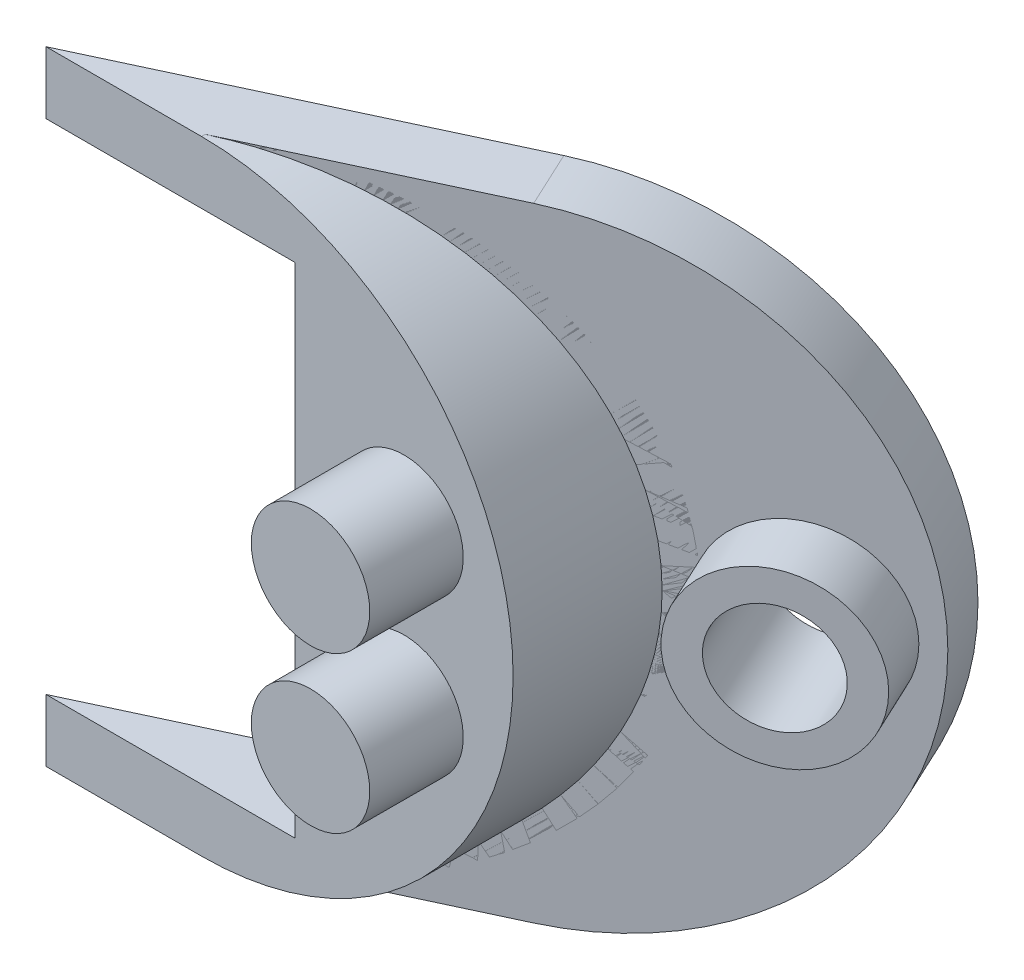
ISO-10303-21;
HEADER;
FILE_DESCRIPTION(('STEP AP214'),'2;1');
FILE_NAME('part.step','',(''),(''),'','','');
FILE_SCHEMA(('AUTOMOTIVE_DESIGN { 1 0 10303 214 1 1 1 1 }'));
ENDSEC;
DATA;
#1=APPLICATION_CONTEXT('core data for automotive mechanical design processes');
#2=APPLICATION_PROTOCOL_DEFINITION('international standard','automotive_design',2000,#1);
#3=PRODUCT_CONTEXT('',#1,'mechanical');
#4=PRODUCT('Part','Part','',(#3));
#5=PRODUCT_RELATED_PRODUCT_CATEGORY('part','',(#4));
#6=PRODUCT_DEFINITION_FORMATION('','',#4);
#7=PRODUCT_DEFINITION_CONTEXT('part definition',#1,'design');
#8=PRODUCT_DEFINITION('design','',#6,#7);
#9=PRODUCT_DEFINITION_SHAPE('','',#8);
#10=(LENGTH_UNIT() NAMED_UNIT(*) SI_UNIT(.MILLI.,.METRE.));
#11=(NAMED_UNIT(*) PLANE_ANGLE_UNIT() SI_UNIT($,.RADIAN.));
#12=(NAMED_UNIT(*) SI_UNIT($,.STERADIAN.) SOLID_ANGLE_UNIT());
#13=UNCERTAINTY_MEASURE_WITH_UNIT(LENGTH_MEASURE(1.E-05),#10,'distance_accuracy_value','');
#14=(GEOMETRIC_REPRESENTATION_CONTEXT(3) GLOBAL_UNCERTAINTY_ASSIGNED_CONTEXT((#13)) GLOBAL_UNIT_ASSIGNED_CONTEXT((#10,
#11,#12)) REPRESENTATION_CONTEXT('',''));
#15=CARTESIAN_POINT('',(0.,0.,0.));
#16=DIRECTION('',(0.,0.,1.));
#17=DIRECTION('',(1.,0.,0.));
#18=AXIS2_PLACEMENT_3D('',#15,#16,#17);
#19=CARTESIAN_POINT('',(-7.57174463256307,19.5675343193672,-20.380808331789));
#20=DIRECTION('',(0.,-1.,0.));
#21=DIRECTION('',(1.,0.,0.));
#22=AXIS2_PLACEMENT_3D('',#19,#20,#21);
#23=PLANE('',#22);
#24=DIRECTION('',(0.906307787036649,0.,-0.4226182617407));
#25=VECTOR('',#24,1.);
#26=CARTESIAN_POINT('',(0.0886997986267258,19.5675343193671,-3.95293223492359));
#27=LINE('',#26,#25);
#28=CARTESIAN_POINT('',(-7.57174463256307,19.5675343193672,-0.380808331788968));
#29=VERTEX_POINT('',#28);
#30=CARTESIAN_POINT('',(0.416706923870062,19.5675343193671,-4.10588446935397));
#31=VERTEX_POINT('',#30);
#32=EDGE_CURVE('E206',#29,#31,#27,.T.);
#33=ORIENTED_EDGE('',*,*,#32,.F.);
#34=DIRECTION('',(1.,0.,0.));
#35=VECTOR('',#34,1.);
#36=CARTESIAN_POINT('',(-7.57174463256307,19.5675343193672,-0.380808331788968));
#37=LINE('',#36,#35);
#38=CARTESIAN_POINT('',(0.416706923870062,19.5675343193671,-0.380808331788968));
#39=VERTEX_POINT('',#38);
#40=EDGE_CURVE('E212',#29,#39,#37,.T.);
#41=ORIENTED_EDGE('',*,*,#40,.T.);
#42=DIRECTION('',(0.,0.,1.));
#43=VECTOR('',#42,1.);
#44=CARTESIAN_POINT('',(0.416706923870062,19.5675343193671,-20.380808331789));
#45=LINE('',#44,#43);
#46=EDGE_CURVE('E240',#31,#39,#45,.T.);
#47=ORIENTED_EDGE('',*,*,#46,.F.);
#48=EDGE_LOOP('',(#33,#41,#47));
#49=FACE_BOUND('',#48,.T.);
#50=ADVANCED_FACE('F83',(#49),#23,.F.);
#51=CARTESIAN_POINT('',(0.416706923870062,19.5675343193671,-20.380808331789));
#52=DIRECTION('',(1.,0.,0.));
#53=DIRECTION('',(0.,1.,0.));
#54=AXIS2_PLACEMENT_3D('',#51,#52,#53);
#55=PLANE('',#54);
#56=DIRECTION('',(0.,1.,0.));
#57=VECTOR('',#56,1.);
#58=CARTESIAN_POINT('',(0.416706923870062,19.5675343193672,-4.10588446935397));
#59=LINE('',#58,#57);
#60=CARTESIAN_POINT('',(0.416706923870064,35.5675343193671,-4.10588446935397));
#61=VERTEX_POINT('',#60);
#62=EDGE_CURVE('E203',#31,#61,#59,.T.);
#63=ORIENTED_EDGE('',*,*,#62,.F.);
#64=ORIENTED_EDGE('',*,*,#46,.T.);
#65=DIRECTION('',(0.,1.,0.));
#66=VECTOR('',#65,1.);
#67=CARTESIAN_POINT('',(0.416706923870062,19.5675343193671,-0.380808331788968));
#68=LINE('',#67,#66);
#69=CARTESIAN_POINT('',(0.416706923870064,35.5675343193671,-0.380808331788968));
#70=VERTEX_POINT('',#69);
#71=EDGE_CURVE('E216',#39,#70,#68,.T.);
#72=ORIENTED_EDGE('',*,*,#71,.T.);
#73=DIRECTION('',(0.,0.,1.));
#74=VECTOR('',#73,1.);
#75=CARTESIAN_POINT('',(0.416706923870064,35.5675343193671,-20.380808331789));
#76=LINE('',#75,#74);
#77=EDGE_CURVE('E237',#61,#70,#76,.T.);
#78=ORIENTED_EDGE('',*,*,#77,.F.);
#79=EDGE_LOOP('',(#63,#64,#72,#78));
#80=FACE_BOUND('',#79,.T.);
#81=ADVANCED_FACE('F268',(#80),#55,.F.);
#82=CARTESIAN_POINT('',(0.416706923870064,35.5675343193671,-20.380808331789));
#83=DIRECTION('',(0.,1.,0.));
#84=DIRECTION('',(0.,0.,1.));
#85=AXIS2_PLACEMENT_3D('',#82,#83,#84);
#86=PLANE('',#85);
#87=DIRECTION('',(-0.906307787036649,0.,0.4226182617407));
#88=VECTOR('',#87,1.);
#89=CARTESIAN_POINT('',(6.65036441737147,35.5675343193671,-7.01268669688898));
#90=LINE('',#89,#88);
#91=CARTESIAN_POINT('',(-7.57174463256307,35.5675343193671,-0.380808331788968));
#92=VERTEX_POINT('',#91);
#93=EDGE_CURVE('E199',#61,#92,#90,.T.);
#94=ORIENTED_EDGE('',*,*,#93,.F.);
#95=ORIENTED_EDGE('',*,*,#77,.T.);
#96=DIRECTION('',(-1.,0.,0.));
#97=VECTOR('',#96,1.);
#98=CARTESIAN_POINT('',(0.416706923870064,35.5675343193671,-0.380808331788968));
#99=LINE('',#98,#97);
#100=EDGE_CURVE('E220',#70,#92,#99,.T.);
#101=ORIENTED_EDGE('',*,*,#100,.T.);
#102=EDGE_LOOP('',(#94,#95,#101));
#103=FACE_BOUND('',#102,.T.);
#104=ADVANCED_FACE('F258',(#103),#86,.F.);
#105=CARTESIAN_POINT('',(-7.57174463256307,37.5675343193672,-20.380808331789));
#106=DIRECTION('',(0.,-1.,0.));
#107=DIRECTION('',(1.,0.,0.));
#108=AXIS2_PLACEMENT_3D('',#105,#106,#107);
#109=PLANE('',#108);
#110=DIRECTION('',(0.90630778703665,0.,-0.4226182617407));
#111=VECTOR('',#110,1.);
#112=CARTESIAN_POINT('',(-1.49821855275069,37.5675343193672,-3.2129400548096));
#113=LINE('',#112,#111);
#114=CARTESIAN_POINT('',(-7.57174463256308,37.5675343193672,-0.380808331788968));
#115=VERTEX_POINT('',#114);
#116=CARTESIAN_POINT('',(3.7608614331266,37.5675343193672,-5.66528932707387));
#117=VERTEX_POINT('',#116);
#118=EDGE_CURVE('E159',#115,#117,#113,.T.);
#119=ORIENTED_EDGE('',*,*,#118,.F.);
#120=DIRECTION('',(1.,0.,0.));
#121=VECTOR('',#120,1.);
#122=CARTESIAN_POINT('',(-7.57174463256307,37.5675343193672,-0.380808331788968));
#123=LINE('',#122,#121);
#124=CARTESIAN_POINT('',(-2.58329307612994,37.5675343193671,-0.380808331788968));
#125=VERTEX_POINT('',#124);
#126=EDGE_CURVE('E227',#115,#125,#123,.T.);
#127=ORIENTED_EDGE('',*,*,#126,.T.);
#128=DIRECTION('',(0.,0.,1.));
#129=VECTOR('',#128,1.);
#130=CARTESIAN_POINT('',(-2.58329307612995,37.5675343193672,-20.380808331789));
#131=LINE('',#130,#129);
#132=CARTESIAN_POINT('',(-2.58329307612994,37.5675343193671,-0.500205656963969));
#133=VERTEX_POINT('',#132);
#134=EDGE_CURVE('E14',#125,#133,#131,.F.);
#135=ORIENTED_EDGE('',*,*,#134,.T.);
#136=DIRECTION('',(0.906307787036649,0.,-0.422618261740702));
#137=VECTOR('',#136,1.);
#138=CARTESIAN_POINT('',(-17.1606748143892,37.5675343193671,6.29733908343521));
#139=LINE('',#138,#137);
#140=CARTESIAN_POINT('',(4.606097956608,37.5675343193672,-3.85267375300057));
#141=VERTEX_POINT('',#140);
#142=EDGE_CURVE('E188',#133,#141,#139,.T.);
#143=ORIENTED_EDGE('',*,*,#142,.T.);
#144=DIRECTION('',(-0.4226182617407,0.,-0.90630778703665));
#145=VECTOR('',#144,1.);
#146=CARTESIAN_POINT('',(4.606097956608,37.5675343193672,-3.85267375300057));
#147=LINE('',#146,#145);
#148=EDGE_CURVE('E170',#141,#117,#147,.T.);
#149=ORIENTED_EDGE('',*,*,#148,.T.);
#150=EDGE_LOOP('',(#119,#127,#135,#143,#149));
#151=FACE_BOUND('',#150,.T.);
#152=ADVANCED_FACE('F257',(#151),#109,.F.);
#153=CARTESIAN_POINT('',(-2.58329307612994,27.5675343193672,-20.380808331789));
#154=DIRECTION('',(0.,0.,1.));
#155=DIRECTION('',(1.,0.,0.));
#156=AXIS2_PLACEMENT_3D('',#153,#154,#155);
#157=CYLINDRICAL_SURFACE('',#156,10.);
#158=DIRECTION('',(0.,0.,1.));
#159=VECTOR('',#158,1.);
#160=CARTESIAN_POINT('',(-2.58329307612993,17.5675343193672,-20.380808331789));
#161=LINE('',#160,#159);
#162=CARTESIAN_POINT('',(-2.58329307612993,17.5675343193672,-0.50020565696398));
#163=VERTEX_POINT('',#162);
#164=CARTESIAN_POINT('',(-2.58329307612993,17.5675343193672,-0.380808331788968));
#165=VERTEX_POINT('',#164);
#166=EDGE_CURVE('E99',#163,#165,#161,.T.);
#167=ORIENTED_EDGE('',*,*,#166,.F.);
#168=CARTESIAN_POINT('',(-2.58329307612994,27.5675343193672,-0.500205656963976));
#169=DIRECTION('',(0.422618261740702,0.,0.906307787036649));
#170=DIRECTION('',(-0.906307787036649,0.,0.422618261740702));
#171=AXIS2_PLACEMENT_3D('',#168,#169,#170);
#172=ELLIPSE('',#171,11.0337791896249,10.);
#173=EDGE_CURVE('E177',#133,#163,#172,.F.);
#174=ORIENTED_EDGE('',*,*,#173,.F.);
#175=ORIENTED_EDGE('',*,*,#134,.F.);
#176=CARTESIAN_POINT('',(-2.58329307612994,27.5675343193672,-0.380808331788968));
#177=DIRECTION('',(0.,0.,-1.));
#178=DIRECTION('',(-1.,0.,0.));
#179=AXIS2_PLACEMENT_3D('',#176,#177,#178);
#180=CIRCLE('',#179,10.);
#181=EDGE_CURVE('E230',#125,#165,#180,.T.);
#182=ORIENTED_EDGE('',*,*,#181,.T.);
#183=EDGE_LOOP('',(#167,#174,#175,#182));
#184=FACE_BOUND('',#183,.T.);
#185=ADVANCED_FACE('F312',(#184),#157,.T.);
#186=CARTESIAN_POINT('',(-2.58329307612993,17.5675343193672,-20.380808331789));
#187=DIRECTION('',(0.,1.,0.));
#188=DIRECTION('',(-1.,0.,0.));
#189=AXIS2_PLACEMENT_3D('',#186,#187,#188);
#190=PLANE('',#189);
#191=DIRECTION('',(0.90630778703665,0.,-0.4226182617407));
#192=VECTOR('',#191,1.);
#193=CARTESIAN_POINT('',(-1.49821855275067,17.5675343193672,-3.2129400548096));
#194=LINE('',#193,#192);
#195=CARTESIAN_POINT('',(-7.57174463256308,17.5675343193672,-0.380808331788962));
#196=VERTEX_POINT('',#195);
#197=CARTESIAN_POINT('',(3.76086143312662,17.5675343193672,-5.66528932707387));
#198=VERTEX_POINT('',#197);
#199=EDGE_CURVE('E148',#196,#198,#194,.T.);
#200=ORIENTED_EDGE('',*,*,#199,.T.);
#201=DIRECTION('',(-0.4226182617407,0.,-0.90630778703665));
#202=VECTOR('',#201,1.);
#203=CARTESIAN_POINT('',(4.60609795660802,17.5675343193672,-3.85267375300057));
#204=LINE('',#203,#202);
#205=CARTESIAN_POINT('',(4.60609795660802,17.5675343193672,-3.85267375300057));
#206=VERTEX_POINT('',#205);
#207=EDGE_CURVE('E151',#206,#198,#204,.T.);
#208=ORIENTED_EDGE('',*,*,#207,.F.);
#209=DIRECTION('',(0.906307787036649,0.,-0.422618261740702));
#210=VECTOR('',#209,1.);
#211=CARTESIAN_POINT('',(-17.1606748143892,17.5675343193671,6.2973390834352));
#212=LINE('',#211,#210);
#213=EDGE_CURVE('E181',#163,#206,#212,.T.);
#214=ORIENTED_EDGE('',*,*,#213,.F.);
#215=ORIENTED_EDGE('',*,*,#166,.T.);
#216=DIRECTION('',(-1.,0.,0.));
#217=VECTOR('',#216,1.);
#218=CARTESIAN_POINT('',(-2.58329307612993,17.5675343193672,-0.380808331788968));
#219=LINE('',#218,#217);
#220=EDGE_CURVE('E154',#165,#196,#219,.T.);
#221=ORIENTED_EDGE('',*,*,#220,.T.);
#222=EDGE_LOOP('',(#200,#208,#214,#215,#221));
#223=FACE_BOUND('',#222,.T.);
#224=ADVANCED_FACE('F150',(#223),#190,.F.);
#225=CARTESIAN_POINT('',(-2.58329307612994,27.5675343193672,-0.380808331788968));
#226=DIRECTION('',(0.,0.,-1.));
#227=DIRECTION('',(-1.,0.,0.));
#228=AXIS2_PLACEMENT_3D('',#225,#226,#227);
#229=PLANE('',#228);
#230=CARTESIAN_POINT('',(3.91670692387007,25.0675343193671,-0.380808331788968));
#231=DIRECTION('',(0.,0.,-1.));
#232=DIRECTION('',(-1.,0.,0.));
#233=AXIS2_PLACEMENT_3D('',#230,#231,#232);
#234=CIRCLE('',#233,1.9);
#235=CARTESIAN_POINT('',(2.01670692387007,25.0675343193671,-0.380808331788968));
#236=VERTEX_POINT('',#235);
#237=EDGE_CURVE('E86',#236,#236,#234,.F.);
#238=ORIENTED_EDGE('',*,*,#237,.F.);
#239=EDGE_LOOP('',(#238));
#240=FACE_BOUND('',#239,.T.);
#241=CARTESIAN_POINT('',(3.91670692387007,30.0675343193671,-0.380808331788968));
#242=DIRECTION('',(0.,0.,-1.));
#243=DIRECTION('',(-1.,0.,0.));
#244=AXIS2_PLACEMENT_3D('',#241,#242,#243);
#245=CIRCLE('',#244,1.9);
#246=CARTESIAN_POINT('',(2.01670692387007,30.0675343193671,-0.380808331788968));
#247=VERTEX_POINT('',#246);
#248=EDGE_CURVE('E242',#247,#247,#245,.F.);
#249=ORIENTED_EDGE('',*,*,#248,.F.);
#250=EDGE_LOOP('',(#249));
#251=FACE_BOUND('',#250,.T.);
#252=DIRECTION('',(0.,1.,0.));
#253=VECTOR('',#252,1.);
#254=CARTESIAN_POINT('',(-7.57174463256307,17.5675343193671,-0.380808331788968));
#255=LINE('',#254,#253);
#256=EDGE_CURVE('E209',#196,#29,#255,.T.);
#257=ORIENTED_EDGE('',*,*,#256,.F.);
#258=ORIENTED_EDGE('',*,*,#220,.F.);
#259=ORIENTED_EDGE('',*,*,#181,.F.);
#260=ORIENTED_EDGE('',*,*,#126,.F.);
#261=DIRECTION('',(0.,1.,0.));
#262=VECTOR('',#261,1.);
#263=CARTESIAN_POINT('',(-7.57174463256307,35.5675343193671,-0.380808331788968));
#264=LINE('',#263,#262);
#265=EDGE_CURVE('E224',#92,#115,#264,.T.);
#266=ORIENTED_EDGE('',*,*,#265,.F.);
#267=ORIENTED_EDGE('',*,*,#100,.F.);
#268=ORIENTED_EDGE('',*,*,#71,.F.);
#269=ORIENTED_EDGE('',*,*,#40,.F.);
#270=EDGE_LOOP('',(#257,#258,#259,#260,#266,#267,#268,#269));
#271=FACE_BOUND('',#270,.T.);
#272=ADVANCED_FACE('F253',(#240,#251,#271),#229,.F.);
#273=CARTESIAN_POINT('',(-1.49821855275069,37.5675343193672,-3.2129400548096));
#274=DIRECTION('',(-0.4226182617407,0.,-0.906307787036649));
#275=DIRECTION('',(-0.906307787036649,0.,0.4226182617407));
#276=AXIS2_PLACEMENT_3D('',#273,#274,#275);
#277=PLANE('',#276);
#278=CARTESIAN_POINT('',(9.69770485194088,27.5675343193672,-8.43368487853408));
#279=DIRECTION('',(-0.4226182617407,0.,-0.906307787036649));
#280=DIRECTION('',(-0.906307787036649,0.,0.4226182617407));
#281=AXIS2_PLACEMENT_3D('',#278,#279,#280);
#282=CIRCLE('',#281,1.75);
#283=CARTESIAN_POINT('',(8.11166622462674,27.5675343193672,-7.69410292048785));
#284=VERTEX_POINT('',#283);
#285=EDGE_CURVE('E171',#284,#284,#282,.F.);
#286=ORIENTED_EDGE('',*,*,#285,.T.);
#287=EDGE_LOOP('',(#286));
#288=FACE_BOUND('',#287,.T.);
#289=ORIENTED_EDGE('',*,*,#32,.T.);
#290=ORIENTED_EDGE('',*,*,#62,.T.);
#291=ORIENTED_EDGE('',*,*,#93,.T.);
#292=ORIENTED_EDGE('',*,*,#265,.T.);
#293=ORIENTED_EDGE('',*,*,#118,.T.);
#294=CARTESIAN_POINT('',(3.76086143312661,27.5675343193672,-5.66528932707387));
#295=DIRECTION('',(-0.4226182617407,0.,-0.90630778703665));
#296=DIRECTION('',(-0.90630778703665,0.,0.4226182617407));
#297=AXIS2_PLACEMENT_3D('',#294,#295,#296);
#298=CIRCLE('',#297,10.);
#299=EDGE_CURVE('E166',#117,#198,#298,.T.);
#300=ORIENTED_EDGE('',*,*,#299,.T.);
#301=ORIENTED_EDGE('',*,*,#199,.F.);
#302=ORIENTED_EDGE('',*,*,#256,.T.);
#303=EDGE_LOOP('',(#289,#290,#291,#292,#293,#300,#301,#302));
#304=FACE_BOUND('',#303,.T.);
#305=ADVANCED_FACE('F173',(#288,#304),#277,.T.);
#306=CARTESIAN_POINT('',(3.91670692387007,30.0675343193671,2.61919166821103));
#307=DIRECTION('',(0.,0.,-1.));
#308=DIRECTION('',(-1.,0.,0.));
#309=AXIS2_PLACEMENT_3D('',#306,#307,#308);
#310=CYLINDRICAL_SURFACE('',#309,1.9);
#311=CARTESIAN_POINT('',(3.91670692387007,30.0675343193671,2.61919166821103));
#312=DIRECTION('',(0.,0.,1.));
#313=DIRECTION('',(1.,0.,0.));
#314=AXIS2_PLACEMENT_3D('',#311,#312,#313);
#315=CIRCLE('',#314,1.9);
#316=CARTESIAN_POINT('',(5.81670692387007,30.0675343193671,2.61919166821103));
#317=VERTEX_POINT('',#316);
#318=EDGE_CURVE('E160',#317,#317,#315,.T.);
#319=ORIENTED_EDGE('',*,*,#318,.F.);
#320=EDGE_LOOP('',(#319));
#321=FACE_BOUND('',#320,.T.);
#322=ORIENTED_EDGE('',*,*,#248,.T.);
#323=EDGE_LOOP('',(#322));
#324=FACE_BOUND('',#323,.T.);
#325=ADVANCED_FACE('F322',(#321,#324),#310,.T.);
#326=CARTESIAN_POINT('',(0.,0.,2.61919166821103));
#327=DIRECTION('',(0.,0.,1.));
#328=DIRECTION('',(1.,0.,0.));
#329=AXIS2_PLACEMENT_3D('',#326,#327,#328);
#330=PLANE('',#329);
#331=ORIENTED_EDGE('',*,*,#318,.T.);
#332=EDGE_LOOP('',(#331));
#333=FACE_BOUND('',#332,.T.);
#334=ADVANCED_FACE('F328',(#333),#330,.T.);
#335=CARTESIAN_POINT('',(3.91670692387007,25.0675343193671,2.61919166821103));
#336=DIRECTION('',(0.,0.,-1.));
#337=DIRECTION('',(-1.,0.,0.));
#338=AXIS2_PLACEMENT_3D('',#335,#336,#337);
#339=CYLINDRICAL_SURFACE('',#338,1.9);
#340=CARTESIAN_POINT('',(3.91670692387007,25.0675343193671,2.61919166821103));
#341=DIRECTION('',(0.,0.,1.));
#342=DIRECTION('',(1.,0.,0.));
#343=AXIS2_PLACEMENT_3D('',#340,#341,#342);
#344=CIRCLE('',#343,1.9);
#345=CARTESIAN_POINT('',(5.81670692387007,25.0675343193671,2.61919166821103));
#346=VERTEX_POINT('',#345);
#347=EDGE_CURVE('E190',#346,#346,#344,.T.);
#348=ORIENTED_EDGE('',*,*,#347,.F.);
#349=EDGE_LOOP('',(#348));
#350=FACE_BOUND('',#349,.T.);
#351=ORIENTED_EDGE('',*,*,#237,.T.);
#352=EDGE_LOOP('',(#351));
#353=FACE_BOUND('',#352,.T.);
#354=ADVANCED_FACE('F251',(#350,#353),#339,.T.);
#355=CARTESIAN_POINT('',(0.,0.,2.61919166821103));
#356=DIRECTION('',(0.,0.,1.));
#357=DIRECTION('',(1.,0.,0.));
#358=AXIS2_PLACEMENT_3D('',#355,#356,#357);
#359=PLANE('',#358);
#360=ORIENTED_EDGE('',*,*,#347,.T.);
#361=EDGE_LOOP('',(#360));
#362=FACE_BOUND('',#361,.T.);
#363=ADVANCED_FACE('F331',(#362),#359,.T.);
#364=CARTESIAN_POINT('',(-17.1606748143892,17.5675343193671,6.2973390834352));
#365=DIRECTION('',(0.422618261740702,0.,0.906307787036649));
#366=DIRECTION('',(0.906307787036649,0.,-0.422618261740702));
#367=AXIS2_PLACEMENT_3D('',#364,#365,#366);
#368=PLANE('',#367);
#369=CARTESIAN_POINT('',(10.5429413754223,27.5675343193672,-6.6210693044608));
#370=DIRECTION('',(0.422618261740702,0.,0.906307787036649));
#371=DIRECTION('',(0.906307787036649,0.,-0.422618261740702));
#372=AXIS2_PLACEMENT_3D('',#369,#370,#371);
#373=CIRCLE('',#372,2.75);
#374=CARTESIAN_POINT('',(13.0352877897731,27.5675343193672,-7.78326952424773));
#375=VERTEX_POINT('',#374);
#376=EDGE_CURVE('E282',#375,#375,#373,.T.);
#377=ORIENTED_EDGE('',*,*,#376,.F.);
#378=EDGE_LOOP('',(#377));
#379=FACE_BOUND('',#378,.T.);
#380=ORIENTED_EDGE('',*,*,#142,.F.);
#381=ORIENTED_EDGE('',*,*,#173,.T.);
#382=ORIENTED_EDGE('',*,*,#213,.T.);
#383=CARTESIAN_POINT('',(4.60609795660801,27.5675343193672,-3.85267375300057));
#384=DIRECTION('',(-0.4226182617407,0.,-0.90630778703665));
#385=DIRECTION('',(-0.90630778703665,0.,0.4226182617407));
#386=AXIS2_PLACEMENT_3D('',#383,#384,#385);
#387=CIRCLE('',#386,10.);
#388=EDGE_CURVE('E168',#141,#206,#387,.T.);
#389=ORIENTED_EDGE('',*,*,#388,.F.);
#390=EDGE_LOOP('',(#380,#381,#382,#389));
#391=FACE_BOUND('',#390,.T.);
#392=ADVANCED_FACE('F309',(#379,#391),#368,.T.);
#393=CARTESIAN_POINT('',(4.60609795660801,27.5675343193672,-3.85267375300057));
#394=DIRECTION('',(-0.4226182617407,0.,-0.90630778703665));
#395=DIRECTION('',(-0.906307787036649,0.,0.4226182617407));
#396=AXIS2_PLACEMENT_3D('',#393,#394,#395);
#397=CYLINDRICAL_SURFACE('',#396,10.);
#398=ORIENTED_EDGE('',*,*,#299,.F.);
#399=ORIENTED_EDGE('',*,*,#148,.F.);
#400=ORIENTED_EDGE('',*,*,#388,.T.);
#401=ORIENTED_EDGE('',*,*,#207,.T.);
#402=EDGE_LOOP('',(#398,#399,#400,#401));
#403=FACE_BOUND('',#402,.T.);
#404=ADVANCED_FACE('F164',(#403),#397,.T.);
#405=CARTESIAN_POINT('',(15.6143605163107,27.5675343193672,4.25462413997901));
#406=DIRECTION('',(-0.4226182617407,0.,-0.906307787036649));
#407=DIRECTION('',(-0.90630778703665,0.,0.4226182617407));
#408=AXIS2_PLACEMENT_3D('',#405,#406,#407);
#409=CYLINDRICAL_SURFACE('',#408,1.75);
#410=CARTESIAN_POINT('',(11.3881778989037,27.5675343193672,-4.8084537303875));
#411=DIRECTION('',(0.422618261740702,0.,0.906307787036649));
#412=DIRECTION('',(0.906307787036649,0.,-0.422618261740702));
#413=AXIS2_PLACEMENT_3D('',#410,#411,#412);
#414=CIRCLE('',#413,1.75);
#415=CARTESIAN_POINT('',(9.80213927158953,27.5675343193672,-4.06887177234127));
#416=VERTEX_POINT('',#415);
#417=EDGE_CURVE('E286',#416,#416,#414,.F.);
#418=CARTESIAN_POINT('',(8.11166622462674,27.5675343193672,-7.69410292048785));
#419=CARTESIAN_POINT('',(8.12927531886594,27.5675343193672,-7.65634009602799));
#420=CARTESIAN_POINT('',(8.14688441310513,27.5675343193672,-7.61857727156813));
#421=CARTESIAN_POINT('',(8.18210260158353,27.5675343193672,-7.54305162264841));
#422=CARTESIAN_POINT('',(8.19971169582272,27.5675343193672,-7.50528879818855));
#423=CARTESIAN_POINT('',(8.23492988430111,27.5675343193672,-7.42976314926883));
#424=CARTESIAN_POINT('',(8.25253897854031,27.5675343193672,-7.39200032480897));
#425=CARTESIAN_POINT('',(8.2877571670187,27.5675343193672,-7.31647467588925));
#426=CARTESIAN_POINT('',(8.30536626125789,27.5675343193672,-7.27871185142939));
#427=CARTESIAN_POINT('',(8.34058444973629,27.5675343193672,-7.20318620250967));
#428=CARTESIAN_POINT('',(8.35819354397548,27.5675343193672,-7.16542337804981));
#429=CARTESIAN_POINT('',(8.39341173245387,27.5675343193672,-7.08989772913009));
#430=CARTESIAN_POINT('',(8.41102082669307,27.5675343193672,-7.05213490467023));
#431=CARTESIAN_POINT('',(8.44623901517146,27.5675343193672,-6.97660925575051));
#432=CARTESIAN_POINT('',(8.46384810941066,27.5675343193672,-6.93884643129064));
#433=CARTESIAN_POINT('',(8.49906629788905,27.5675343193672,-6.86332078237092));
#434=CARTESIAN_POINT('',(8.51667539212824,27.5675343193672,-6.82555795791106));
#435=CARTESIAN_POINT('',(8.55189358060663,27.5675343193672,-6.75003230899134));
#436=CARTESIAN_POINT('',(8.56950267484583,27.5675343193672,-6.71226948453148));
#437=CARTESIAN_POINT('',(8.60472086332422,27.5675343193672,-6.63674383561176));
#438=CARTESIAN_POINT('',(8.62232995756342,27.5675343193672,-6.5989810111519));
#439=CARTESIAN_POINT('',(8.65754814604181,27.5675343193672,-6.52345536223218));
#440=CARTESIAN_POINT('',(8.675157240281,27.5675343193672,-6.48569253777232));
#441=CARTESIAN_POINT('',(8.7103754287594,27.5675343193672,-6.4101668888526));
#442=CARTESIAN_POINT('',(8.72798452299859,27.5675343193672,-6.37240406439274));
#443=CARTESIAN_POINT('',(8.76320271147699,27.5675343193672,-6.29687841547302));
#444=CARTESIAN_POINT('',(8.78081180571618,27.5675343193672,-6.25911559101316));
#445=CARTESIAN_POINT('',(8.81602999419457,27.5675343193672,-6.18358994209344));
#446=CARTESIAN_POINT('',(8.83363908843377,27.5675343193672,-6.14582711763358));
#447=CARTESIAN_POINT('',(8.86885727691216,27.5675343193672,-6.07030146871386));
#448=CARTESIAN_POINT('',(8.88646637115136,27.5675343193672,-6.032538644254));
#449=CARTESIAN_POINT('',(8.92168455962975,27.5675343193672,-5.95701299533428));
#450=CARTESIAN_POINT('',(8.93929365386894,27.5675343193672,-5.91925017087442));
#451=CARTESIAN_POINT('',(8.97451184234733,27.5675343193672,-5.8437245219547));
#452=CARTESIAN_POINT('',(8.99212093658653,27.5675343193672,-5.80596169749484));
#453=CARTESIAN_POINT('',(9.02733912506492,27.5675343193672,-5.73043604857512));
#454=CARTESIAN_POINT('',(9.04494821930412,27.5675343193672,-5.69267322411526));
#455=CARTESIAN_POINT('',(9.08016640778251,27.5675343193672,-5.61714757519554));
#456=CARTESIAN_POINT('',(9.0977755020217,27.5675343193672,-5.57938475073568));
#457=CARTESIAN_POINT('',(9.1329936905001,27.5675343193672,-5.50385910181596));
#458=CARTESIAN_POINT('',(9.15060278473929,27.5675343193672,-5.4660962773561));
#459=CARTESIAN_POINT('',(9.18582097321768,27.5675343193672,-5.39057062843638));
#460=CARTESIAN_POINT('',(9.20343006745688,27.5675343193672,-5.35280780397652));
#461=CARTESIAN_POINT('',(9.23864825593527,27.5675343193672,-5.2772821550568));
#462=CARTESIAN_POINT('',(9.25625735017447,27.5675343193672,-5.23951933059694));
#463=CARTESIAN_POINT('',(9.29147553865286,27.5675343193672,-5.16399368167722));
#464=CARTESIAN_POINT('',(9.30908463289205,27.5675343193672,-5.12623085721736));
#465=CARTESIAN_POINT('',(9.34430282137044,27.5675343193672,-5.05070520829763));
#466=CARTESIAN_POINT('',(9.36191191560964,27.5675343193672,-5.01294238383777));
#467=CARTESIAN_POINT('',(9.39713010408803,27.5675343193672,-4.93741673491805));
#468=CARTESIAN_POINT('',(9.41473919832723,27.5675343193672,-4.89965391045819));
#469=CARTESIAN_POINT('',(9.44995738680562,27.5675343193672,-4.82412826153847));
#470=CARTESIAN_POINT('',(9.46756648104481,27.5675343193672,-4.78636543707861));
#471=CARTESIAN_POINT('',(9.50278466952321,27.5675343193672,-4.71083978815889));
#472=CARTESIAN_POINT('',(9.5203937637624,27.5675343193672,-4.67307696369903));
#473=CARTESIAN_POINT('',(9.55561195224079,27.5675343193672,-4.59755131477931));
#474=CARTESIAN_POINT('',(9.57322104647999,27.5675343193672,-4.55978849031945));
#475=CARTESIAN_POINT('',(9.60843923495838,27.5675343193672,-4.48426284139973));
#476=CARTESIAN_POINT('',(9.62604832919757,27.5675343193672,-4.44650001693987));
#477=CARTESIAN_POINT('',(9.66126651767597,27.5675343193672,-4.37097436802015));
#478=CARTESIAN_POINT('',(9.67887561191516,27.5675343193672,-4.33321154356029));
#479=CARTESIAN_POINT('',(9.71409380039356,27.5675343193672,-4.25768589464057));
#480=CARTESIAN_POINT('',(9.73170289463275,27.5675343193672,-4.21992307018071));
#481=CARTESIAN_POINT('',(9.76692108311114,27.5675343193672,-4.14439742126099));
#482=CARTESIAN_POINT('',(9.78453017735034,27.5675343193672,-4.10663459680113));
#483=CARTESIAN_POINT('',(9.80213927158953,27.5675343193672,-4.06887177234127));
#484=B_SPLINE_CURVE_WITH_KNOTS('',3,(#418,#419,#420,#421,#422,#423,#424,#425,#426,#427,#428,
#429,#430,#431,#432,#433,#434,#435,#436,#437,#438,#439,#440,#441,#442,#443,#444,#445,#446,#447,
#448,#449,#450,#451,#452,#453,#454,#455,#456,#457,#458,#459,#460,#461,#462,#463,#464,#465,#466,
#467,#468,#469,#470,#471,#472,#473,#474,#475,#476,#477,#478,#479,#480,#481,#482,#483),
.UNSPECIFIED.,.F.,.F.,(4,2,2,2,2,2,2,2,2,2,2,2,2,2,2,2,2,2,2,2,2,2,2,2,2,2,2,2,2,2,2,2,4),(0.,
0.125,0.249999999999999,0.374999999999998,0.499999999999996,0.624999999999997,0.749999999999995,
0.874999999999996,0.999999999999994,1.12499999999999,1.24999999999999,1.37499999999999,
1.49999999999999,1.62499999999999,1.74999999999999,1.87499999999999,1.99999999999999,
2.12499999999999,2.24999999999999,2.37499999999999,2.49999999999999,2.62499999999998,
2.74999999999998,2.87499999999998,2.99999999999998,3.12499999999998,3.24999999999998,
3.37499999999998,3.49999999999998,3.62499999999998,3.74999999999998,3.87499999999998,
3.99999999999998),.UNSPECIFIED.);
#485=EDGE_CURVE('BSEAM297',#284,#416,#484,.T.);
#486=ORIENTED_EDGE('',*,*,#285,.F.);
#487=ORIENTED_EDGE('',*,*,#417,.F.);
#488=ORIENTED_EDGE('',*,*,#485,.T.);
#489=ORIENTED_EDGE('',*,*,#485,.F.);
#490=EDGE_LOOP('',(#486,#488,#487,#489));
#491=FACE_BOUND('',#490,.T.);
#492=ADVANCED_FACE('F297',(#491),#409,.F.);
#493=CARTESIAN_POINT('',(11.3881778989037,27.5675343193672,-4.8084537303875));
#494=DIRECTION('',(-0.422618261740702,0.,-0.906307787036649));
#495=DIRECTION('',(-0.906307787036649,0.,0.422618261740702));
#496=AXIS2_PLACEMENT_3D('',#493,#494,#495);
#497=CYLINDRICAL_SURFACE('',#496,2.75);
#498=CARTESIAN_POINT('',(11.3881778989037,27.5675343193672,-4.8084537303875));
#499=DIRECTION('',(0.422618261740702,0.,0.906307787036649));
#500=DIRECTION('',(0.906307787036649,0.,-0.422618261740702));
#501=AXIS2_PLACEMENT_3D('',#498,#499,#500);
#502=CIRCLE('',#501,2.75);
#503=CARTESIAN_POINT('',(13.8805243132545,27.5675343193672,-5.97065395017443));
#504=VERTEX_POINT('',#503);
#505=EDGE_CURVE('E281',#504,#504,#502,.T.);
#506=ORIENTED_EDGE('',*,*,#505,.F.);
#507=EDGE_LOOP('',(#506));
#508=FACE_BOUND('',#507,.T.);
#509=ORIENTED_EDGE('',*,*,#376,.T.);
#510=EDGE_LOOP('',(#509));
#511=FACE_BOUND('',#510,.T.);
#512=ADVANCED_FACE('F299',(#508,#511),#497,.T.);
#513=CARTESIAN_POINT('',(0.192254494212136,0.,0.412291093336988));
#514=DIRECTION('',(0.422618261740702,0.,0.906307787036649));
#515=DIRECTION('',(0.906307787036649,0.,-0.422618261740702));
#516=AXIS2_PLACEMENT_3D('',#513,#514,#515);
#517=PLANE('',#516);
#518=ORIENTED_EDGE('',*,*,#417,.T.);
#519=EDGE_LOOP('',(#518));
#520=FACE_BOUND('',#519,.T.);
#521=ORIENTED_EDGE('',*,*,#505,.T.);
#522=EDGE_LOOP('',(#521));
#523=FACE_BOUND('',#522,.T.);
#524=ADVANCED_FACE('F294',(#520,#523),#517,.T.);
#525=CLOSED_SHELL('',(#50,#81,#104,#152,#185,#224,#272,#305,#325,#334,#354,#363,#392,#404,#492,
#512,#524));
#526=MANIFOLD_SOLID_BREP('B2',#525);
#527=CARTESIAN_POINT('',(-17.1606748143892,37.5675343193671,6.29733908343521));
#528=DIRECTION('',(0.,-1.,0.));
#529=DIRECTION('',(1.,0.,0.));
#530=AXIS2_PLACEMENT_3D('',#527,#528,#529);
#531=PLANE('',#530);
#532=DIRECTION('',(0.,0.,1.));
#533=VECTOR('',#532,1.);
#534=CARTESIAN_POINT('',(-2.58329307612995,37.5675343193672,-20.380808331789));
#535=LINE('',#534,#533);
#536=CARTESIAN_POINT('',(-2.58329307612994,37.5675343193671,-0.500205656963969));
#537=VERTEX_POINT('',#536);
#538=CARTESIAN_POINT('',(-2.58329307612994,37.5675343193671,-2.70696149488896));
#539=VERTEX_POINT('',#538);
#540=EDGE_CURVE('E537',#537,#539,#535,.F.);
#541=ORIENTED_EDGE('',*,*,#540,.F.);
#542=DIRECTION('',(0.906307787036649,0.,-0.422618261740702));
#543=VECTOR('',#542,1.);
#544=CARTESIAN_POINT('',(-17.1606748143892,37.5675343193671,6.29733908343521));
#545=LINE('',#544,#543);
#546=CARTESIAN_POINT('',(-1.73805655264854,37.5675343193671,-0.894345920815658));
#547=VERTEX_POINT('',#546);
#548=EDGE_CURVE('E538',#537,#547,#545,.T.);
#549=ORIENTED_EDGE('',*,*,#548,.T.);
#550=DIRECTION('',(-0.4226182617407,0.,-0.90630778703665));
#551=VECTOR('',#550,1.);
#552=CARTESIAN_POINT('',(-1.73805655264854,37.5675343193671,-0.894345920815658));
#553=LINE('',#552,#551);
#554=EDGE_CURVE('E534',#547,#539,#553,.T.);
#555=ORIENTED_EDGE('',*,*,#554,.T.);
#556=EDGE_LOOP('',(#541,#549,#555));
#557=FACE_BOUND('',#556,.T.);
#558=ADVANCED_FACE('F496',(#557),#531,.F.);
#559=CARTESIAN_POINT('',(-17.1606748143892,17.5675343193671,6.2973390834352));
#560=DIRECTION('',(0.422618261740702,0.,0.906307787036649));
#561=DIRECTION('',(0.906307787036649,0.,-0.422618261740702));
#562=AXIS2_PLACEMENT_3D('',#559,#560,#561);
#563=PLANE('',#562);
#564=ORIENTED_EDGE('',*,*,#548,.F.);
#565=CARTESIAN_POINT('',(-2.58329307612994,27.5675343193672,-0.500205656963976));
#566=DIRECTION('',(0.422618261740702,0.,0.906307787036649));
#567=DIRECTION('',(-0.906307787036649,0.,0.422618261740702));
#568=AXIS2_PLACEMENT_3D('',#565,#566,#567);
#569=ELLIPSE('',#568,11.0337791896249,10.);
#570=CARTESIAN_POINT('',(-2.58329307612993,17.5675343193672,-0.50020565696398));
#571=VERTEX_POINT('',#570);
#572=EDGE_CURVE('E503',#537,#571,#569,.F.);
#573=ORIENTED_EDGE('',*,*,#572,.T.);
#574=DIRECTION('',(0.906307787036649,0.,-0.422618261740702));
#575=VECTOR('',#574,1.);
#576=CARTESIAN_POINT('',(-17.1606748143892,17.5675343193671,6.2973390834352));
#577=LINE('',#576,#575);
#578=CARTESIAN_POINT('',(-1.73805655264853,17.5675343193672,-0.894345920815667));
#579=VERTEX_POINT('',#578);
#580=EDGE_CURVE('E526',#571,#579,#577,.T.);
#581=ORIENTED_EDGE('',*,*,#580,.T.);
#582=CARTESIAN_POINT('',(-1.73805655264853,27.5675343193672,-0.894345920815662));
#583=DIRECTION('',(-0.4226182617407,0.,-0.906307787036649));
#584=DIRECTION('',(-0.906307787036649,0.,0.4226182617407));
#585=AXIS2_PLACEMENT_3D('',#582,#583,#584);
#586=ELLIPSE('',#585,11.0337791896249,10.);
#587=EDGE_CURVE('E528',#547,#579,#586,.T.);
#588=ORIENTED_EDGE('',*,*,#587,.F.);
#589=EDGE_LOOP('',(#564,#573,#581,#588));
#590=FACE_BOUND('',#589,.T.);
#591=ADVANCED_FACE('F536',(#590),#563,.T.);
#592=CARTESIAN_POINT('',(-17.1606748143892,17.5675343193671,6.2973390834352));
#593=DIRECTION('',(0.,-1.,0.));
#594=DIRECTION('',(1.,0.,0.));
#595=AXIS2_PLACEMENT_3D('',#592,#593,#594);
#596=PLANE('',#595);
#597=ORIENTED_EDGE('',*,*,#580,.F.);
#598=DIRECTION('',(0.,0.,1.));
#599=VECTOR('',#598,1.);
#600=CARTESIAN_POINT('',(-2.58329307612993,17.5675343193672,-20.380808331789));
#601=LINE('',#600,#599);
#602=CARTESIAN_POINT('',(-2.58329307612993,17.5675343193672,-2.70696149488897));
#603=VERTEX_POINT('',#602);
#604=EDGE_CURVE('E81',#571,#603,#601,.F.);
#605=ORIENTED_EDGE('',*,*,#604,.T.);
#606=DIRECTION('',(-0.4226182617407,0.,-0.90630778703665));
#607=VECTOR('',#606,1.);
#608=CARTESIAN_POINT('',(-1.73805655264853,17.5675343193672,-0.894345920815667));
#609=LINE('',#608,#607);
#610=EDGE_CURVE('E523',#579,#603,#609,.T.);
#611=ORIENTED_EDGE('',*,*,#610,.F.);
#612=EDGE_LOOP('',(#597,#605,#611));
#613=FACE_BOUND('',#612,.T.);
#614=ADVANCED_FACE('F497',(#613),#596,.T.);
#615=OPEN_SHELL('',(#558,#591,#614));
#616=SHELL_BASED_SURFACE_MODEL('B8',(#615));
#617=ADVANCED_BREP_SHAPE_REPRESENTATION('',(#18,#526),#14);
#618=MANIFOLD_SURFACE_SHAPE_REPRESENTATION('',(#18,#616),#14);
#619=SHAPE_REPRESENTATION('',(#18),#14);
#620=SHAPE_DEFINITION_REPRESENTATION(#9,#619);
#621=SHAPE_REPRESENTATION_RELATIONSHIP('','',#619,#617);
#622=SHAPE_REPRESENTATION_RELATIONSHIP('','',#619,#618);
ENDSEC;
END-ISO-10303-21;
